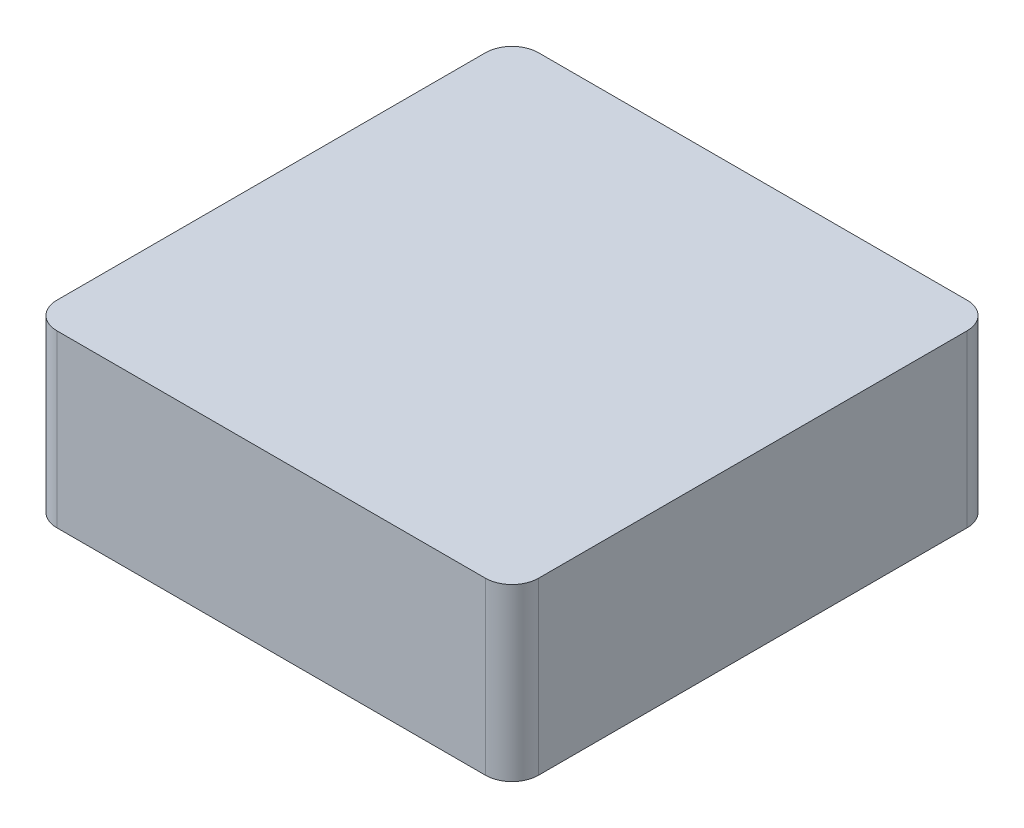
ISO-10303-21;
HEADER;
FILE_DESCRIPTION(('STEP AP214'),'2;1');
FILE_NAME('part.step','',(''),(''),'','','');
FILE_SCHEMA(('AUTOMOTIVE_DESIGN { 1 0 10303 214 1 1 1 1 }'));
ENDSEC;
DATA;
#1=APPLICATION_CONTEXT('core data for automotive mechanical design processes');
#2=APPLICATION_PROTOCOL_DEFINITION('international standard','automotive_design',2000,#1);
#3=PRODUCT_CONTEXT('',#1,'mechanical');
#4=PRODUCT('Part','Part','',(#3));
#5=PRODUCT_RELATED_PRODUCT_CATEGORY('part','',(#4));
#6=PRODUCT_DEFINITION_FORMATION('','',#4);
#7=PRODUCT_DEFINITION_CONTEXT('part definition',#1,'design');
#8=PRODUCT_DEFINITION('design','',#6,#7);
#9=PRODUCT_DEFINITION_SHAPE('','',#8);
#10=(LENGTH_UNIT() NAMED_UNIT(*) SI_UNIT(.MILLI.,.METRE.));
#11=(NAMED_UNIT(*) PLANE_ANGLE_UNIT() SI_UNIT($,.RADIAN.));
#12=(NAMED_UNIT(*) SI_UNIT($,.STERADIAN.) SOLID_ANGLE_UNIT());
#13=UNCERTAINTY_MEASURE_WITH_UNIT(LENGTH_MEASURE(1.E-05),#10,'distance_accuracy_value','');
#14=(GEOMETRIC_REPRESENTATION_CONTEXT(3) GLOBAL_UNCERTAINTY_ASSIGNED_CONTEXT((#13)) GLOBAL_UNIT_ASSIGNED_CONTEXT((#10,
#11,#12)) REPRESENTATION_CONTEXT('',''));
#15=CARTESIAN_POINT('',(0.,0.,0.));
#16=DIRECTION('',(0.,0.,1.));
#17=DIRECTION('',(1.,0.,0.));
#18=AXIS2_PLACEMENT_3D('',#15,#16,#17);
#19=CARTESIAN_POINT('',(0.,45.,0.));
#20=DIRECTION('',(1.,0.,0.));
#21=DIRECTION('',(0.,0.,-1.));
#22=AXIS2_PLACEMENT_3D('',#19,#20,#21);
#23=PLANE('',#22);
#24=DIRECTION('',(0.,0.,1.));
#25=VECTOR('',#24,1.);
#26=CARTESIAN_POINT('',(0.,45.,0.));
#27=LINE('',#26,#25);
#28=CARTESIAN_POINT('',(0.,45.,-120.));
#29=VERTEX_POINT('',#28);
#30=CARTESIAN_POINT('',(0.,45.,-7.));
#31=VERTEX_POINT('',#30);
#32=EDGE_CURVE('E126',#29,#31,#27,.T.);
#33=ORIENTED_EDGE('',*,*,#32,.F.);
#34=DIRECTION('',(0.,-1.,0.));
#35=VECTOR('',#34,1.);
#36=CARTESIAN_POINT('',(0.,45.,-120.));
#37=LINE('',#36,#35);
#38=CARTESIAN_POINT('',(0.,0.,-120.));
#39=VERTEX_POINT('',#38);
#40=EDGE_CURVE('E152',#29,#39,#37,.T.);
#41=ORIENTED_EDGE('',*,*,#40,.T.);
#42=DIRECTION('',(0.,0.,1.));
#43=VECTOR('',#42,1.);
#44=CARTESIAN_POINT('',(0.,0.,0.));
#45=LINE('',#44,#43);
#46=CARTESIAN_POINT('',(0.,0.,-7.));
#47=VERTEX_POINT('',#46);
#48=EDGE_CURVE('E160',#39,#47,#45,.T.);
#49=ORIENTED_EDGE('',*,*,#48,.T.);
#50=DIRECTION('',(0.,-1.,0.));
#51=VECTOR('',#50,1.);
#52=CARTESIAN_POINT('',(0.,45.,-7.));
#53=LINE('',#52,#51);
#54=EDGE_CURVE('E150',#47,#31,#53,.F.);
#55=ORIENTED_EDGE('',*,*,#54,.T.);
#56=EDGE_LOOP('',(#33,#41,#49,#55));
#57=FACE_BOUND('',#56,.T.);
#58=ADVANCED_FACE('F35',(#57),#23,.F.);
#59=CARTESIAN_POINT('',(0.,45.,0.));
#60=DIRECTION('',(0.,0.,-1.));
#61=DIRECTION('',(-1.,0.,0.));
#62=AXIS2_PLACEMENT_3D('',#59,#60,#61);
#63=PLANE('',#62);
#64=DIRECTION('',(1.,0.,0.));
#65=VECTOR('',#64,1.);
#66=CARTESIAN_POINT('',(0.,0.,0.));
#67=LINE('',#66,#65);
#68=CARTESIAN_POINT('',(7.,0.,0.));
#69=VERTEX_POINT('',#68);
#70=CARTESIAN_POINT('',(120.,0.,0.));
#71=VERTEX_POINT('',#70);
#72=EDGE_CURVE('E131',#69,#71,#67,.T.);
#73=ORIENTED_EDGE('',*,*,#72,.T.);
#74=DIRECTION('',(0.,-1.,0.));
#75=VECTOR('',#74,1.);
#76=CARTESIAN_POINT('',(120.,45.,0.));
#77=LINE('',#76,#75);
#78=CARTESIAN_POINT('',(120.,45.,0.));
#79=VERTEX_POINT('',#78);
#80=EDGE_CURVE('E11',#71,#79,#77,.F.);
#81=ORIENTED_EDGE('',*,*,#80,.T.);
#82=DIRECTION('',(1.,0.,0.));
#83=VECTOR('',#82,1.);
#84=CARTESIAN_POINT('',(0.,45.,0.));
#85=LINE('',#84,#83);
#86=CARTESIAN_POINT('',(7.,45.,0.));
#87=VERTEX_POINT('',#86);
#88=EDGE_CURVE('E129',#87,#79,#85,.T.);
#89=ORIENTED_EDGE('',*,*,#88,.F.);
#90=DIRECTION('',(0.,-1.,0.));
#91=VECTOR('',#90,1.);
#92=CARTESIAN_POINT('',(7.,45.,0.));
#93=LINE('',#92,#91);
#94=EDGE_CURVE('E43',#87,#69,#93,.T.);
#95=ORIENTED_EDGE('',*,*,#94,.T.);
#96=EDGE_LOOP('',(#73,#81,#89,#95));
#97=FACE_BOUND('',#96,.T.);
#98=ADVANCED_FACE('F157',(#97),#63,.F.);
#99=CARTESIAN_POINT('',(127.,45.,0.));
#100=DIRECTION('',(-1.,0.,0.));
#101=DIRECTION('',(0.,0.,1.));
#102=AXIS2_PLACEMENT_3D('',#99,#100,#101);
#103=PLANE('',#102);
#104=DIRECTION('',(0.,0.,-1.));
#105=VECTOR('',#104,1.);
#106=CARTESIAN_POINT('',(127.,0.,0.));
#107=LINE('',#106,#105);
#108=CARTESIAN_POINT('',(127.,0.,-7.));
#109=VERTEX_POINT('',#108);
#110=CARTESIAN_POINT('',(127.,0.,-120.));
#111=VERTEX_POINT('',#110);
#112=EDGE_CURVE('E127',#109,#111,#107,.T.);
#113=ORIENTED_EDGE('',*,*,#112,.T.);
#114=DIRECTION('',(0.,-1.,0.));
#115=VECTOR('',#114,1.);
#116=CARTESIAN_POINT('',(127.,45.,-120.));
#117=LINE('',#116,#115);
#118=CARTESIAN_POINT('',(127.,45.,-120.));
#119=VERTEX_POINT('',#118);
#120=EDGE_CURVE('E105',#111,#119,#117,.F.);
#121=ORIENTED_EDGE('',*,*,#120,.T.);
#122=DIRECTION('',(0.,0.,-1.));
#123=VECTOR('',#122,1.);
#124=CARTESIAN_POINT('',(127.,45.,0.));
#125=LINE('',#124,#123);
#126=CARTESIAN_POINT('',(127.,45.,-7.));
#127=VERTEX_POINT('',#126);
#128=EDGE_CURVE('E164',#127,#119,#125,.T.);
#129=ORIENTED_EDGE('',*,*,#128,.F.);
#130=DIRECTION('',(0.,-1.,0.));
#131=VECTOR('',#130,1.);
#132=CARTESIAN_POINT('',(127.,45.,-7.));
#133=LINE('',#132,#131);
#134=EDGE_CURVE('E110',#127,#109,#133,.T.);
#135=ORIENTED_EDGE('',*,*,#134,.T.);
#136=EDGE_LOOP('',(#113,#121,#129,#135));
#137=FACE_BOUND('',#136,.T.);
#138=ADVANCED_FACE('F174',(#137),#103,.F.);
#139=CARTESIAN_POINT('',(0.,45.,-127.));
#140=DIRECTION('',(0.,0.,1.));
#141=DIRECTION('',(1.,0.,0.));
#142=AXIS2_PLACEMENT_3D('',#139,#140,#141);
#143=PLANE('',#142);
#144=DIRECTION('',(-1.,0.,0.));
#145=VECTOR('',#144,1.);
#146=CARTESIAN_POINT('',(0.,45.,-127.));
#147=LINE('',#146,#145);
#148=CARTESIAN_POINT('',(120.,45.,-127.));
#149=VERTEX_POINT('',#148);
#150=CARTESIAN_POINT('',(7.,45.,-127.));
#151=VERTEX_POINT('',#150);
#152=EDGE_CURVE('E120',#149,#151,#147,.T.);
#153=ORIENTED_EDGE('',*,*,#152,.F.);
#154=DIRECTION('',(0.,-1.,0.));
#155=VECTOR('',#154,1.);
#156=CARTESIAN_POINT('',(120.,45.,-127.));
#157=LINE('',#156,#155);
#158=CARTESIAN_POINT('',(120.,0.,-127.));
#159=VERTEX_POINT('',#158);
#160=EDGE_CURVE('E104',#149,#159,#157,.T.);
#161=ORIENTED_EDGE('',*,*,#160,.T.);
#162=DIRECTION('',(-1.,0.,0.));
#163=VECTOR('',#162,1.);
#164=CARTESIAN_POINT('',(0.,0.,-127.));
#165=LINE('',#164,#163);
#166=CARTESIAN_POINT('',(7.,0.,-127.));
#167=VERTEX_POINT('',#166);
#168=EDGE_CURVE('E117',#159,#167,#165,.T.);
#169=ORIENTED_EDGE('',*,*,#168,.T.);
#170=DIRECTION('',(0.,-1.,0.));
#171=VECTOR('',#170,1.);
#172=CARTESIAN_POINT('',(7.,45.,-127.));
#173=LINE('',#172,#171);
#174=EDGE_CURVE('E122',#167,#151,#173,.F.);
#175=ORIENTED_EDGE('',*,*,#174,.T.);
#176=EDGE_LOOP('',(#153,#161,#169,#175));
#177=FACE_BOUND('',#176,.T.);
#178=ADVANCED_FACE('F116',(#177),#143,.F.);
#179=CARTESIAN_POINT('',(0.,45.,0.));
#180=DIRECTION('',(0.,-1.,0.));
#181=DIRECTION('',(0.,0.,-1.));
#182=AXIS2_PLACEMENT_3D('',#179,#180,#181);
#183=PLANE('',#182);
#184=ORIENTED_EDGE('',*,*,#128,.T.);
#185=CARTESIAN_POINT('',(120.,45.,-120.));
#186=DIRECTION('',(0.,-1.,0.));
#187=DIRECTION('',(0.,0.,-1.));
#188=AXIS2_PLACEMENT_3D('',#185,#186,#187);
#189=CIRCLE('',#188,7.);
#190=EDGE_CURVE('E148',#119,#149,#189,.F.);
#191=ORIENTED_EDGE('',*,*,#190,.T.);
#192=ORIENTED_EDGE('',*,*,#152,.T.);
#193=CARTESIAN_POINT('',(7.,45.,-120.));
#194=DIRECTION('',(0.,-1.,0.));
#195=DIRECTION('',(0.,0.,-1.));
#196=AXIS2_PLACEMENT_3D('',#193,#194,#195);
#197=CIRCLE('',#196,7.);
#198=EDGE_CURVE('E146',#151,#29,#197,.F.);
#199=ORIENTED_EDGE('',*,*,#198,.T.);
#200=ORIENTED_EDGE('',*,*,#32,.T.);
#201=CARTESIAN_POINT('',(7.,45.,-7.));
#202=DIRECTION('',(0.,-1.,0.));
#203=DIRECTION('',(0.,0.,-1.));
#204=AXIS2_PLACEMENT_3D('',#201,#202,#203);
#205=CIRCLE('',#204,7.);
#206=EDGE_CURVE('E55',#31,#87,#205,.F.);
#207=ORIENTED_EDGE('',*,*,#206,.T.);
#208=ORIENTED_EDGE('',*,*,#88,.T.);
#209=CARTESIAN_POINT('',(120.,45.,-7.));
#210=DIRECTION('',(0.,-1.,0.));
#211=DIRECTION('',(0.,0.,-1.));
#212=AXIS2_PLACEMENT_3D('',#209,#210,#211);
#213=CIRCLE('',#212,7.);
#214=EDGE_CURVE('E144',#79,#127,#213,.F.);
#215=ORIENTED_EDGE('',*,*,#214,.T.);
#216=EDGE_LOOP('',(#184,#191,#192,#199,#200,#207,#208,#215));
#217=FACE_BOUND('',#216,.T.);
#218=ADVANCED_FACE('F168',(#217),#183,.F.);
#219=CARTESIAN_POINT('',(0.,0.,0.));
#220=DIRECTION('',(0.,-1.,0.));
#221=DIRECTION('',(0.,0.,-1.));
#222=AXIS2_PLACEMENT_3D('',#219,#220,#221);
#223=PLANE('',#222);
#224=ORIENTED_EDGE('',*,*,#168,.F.);
#225=CARTESIAN_POINT('',(120.,0.,-120.));
#226=DIRECTION('',(0.,-1.,0.));
#227=DIRECTION('',(0.,0.,-1.));
#228=AXIS2_PLACEMENT_3D('',#225,#226,#227);
#229=CIRCLE('',#228,7.);
#230=EDGE_CURVE('E100',#159,#111,#229,.T.);
#231=ORIENTED_EDGE('',*,*,#230,.T.);
#232=ORIENTED_EDGE('',*,*,#112,.F.);
#233=CARTESIAN_POINT('',(120.,0.,-7.));
#234=DIRECTION('',(0.,-1.,0.));
#235=DIRECTION('',(0.,0.,-1.));
#236=AXIS2_PLACEMENT_3D('',#233,#234,#235);
#237=CIRCLE('',#236,7.);
#238=EDGE_CURVE('E137',#109,#71,#237,.T.);
#239=ORIENTED_EDGE('',*,*,#238,.T.);
#240=ORIENTED_EDGE('',*,*,#72,.F.);
#241=CARTESIAN_POINT('',(7.,0.,-7.));
#242=DIRECTION('',(0.,-1.,0.));
#243=DIRECTION('',(0.,0.,-1.));
#244=AXIS2_PLACEMENT_3D('',#241,#242,#243);
#245=CIRCLE('',#244,7.);
#246=EDGE_CURVE('E121',#69,#47,#245,.T.);
#247=ORIENTED_EDGE('',*,*,#246,.T.);
#248=ORIENTED_EDGE('',*,*,#48,.F.);
#249=CARTESIAN_POINT('',(7.,0.,-120.));
#250=DIRECTION('',(0.,-1.,0.));
#251=DIRECTION('',(0.,0.,-1.));
#252=AXIS2_PLACEMENT_3D('',#249,#250,#251);
#253=CIRCLE('',#252,7.);
#254=EDGE_CURVE('E111',#39,#167,#253,.T.);
#255=ORIENTED_EDGE('',*,*,#254,.T.);
#256=EDGE_LOOP('',(#224,#231,#232,#239,#240,#247,#248,#255));
#257=FACE_BOUND('',#256,.T.);
#258=ADVANCED_FACE('F124',(#257),#223,.T.);
#259=CARTESIAN_POINT('',(120.,45.,-120.));
#260=DIRECTION('',(0.,-1.,0.));
#261=DIRECTION('',(0.,0.,-1.));
#262=AXIS2_PLACEMENT_3D('',#259,#260,#261);
#263=CYLINDRICAL_SURFACE('',#262,7.);
#264=ORIENTED_EDGE('',*,*,#190,.F.);
#265=ORIENTED_EDGE('',*,*,#120,.F.);
#266=ORIENTED_EDGE('',*,*,#230,.F.);
#267=ORIENTED_EDGE('',*,*,#160,.F.);
#268=EDGE_LOOP('',(#264,#265,#266,#267));
#269=FACE_BOUND('',#268,.T.);
#270=ADVANCED_FACE('F103',(#269),#263,.T.);
#271=CARTESIAN_POINT('',(7.,45.,-120.));
#272=DIRECTION('',(0.,-1.,0.));
#273=DIRECTION('',(0.,0.,-1.));
#274=AXIS2_PLACEMENT_3D('',#271,#272,#273);
#275=CYLINDRICAL_SURFACE('',#274,7.);
#276=ORIENTED_EDGE('',*,*,#198,.F.);
#277=ORIENTED_EDGE('',*,*,#174,.F.);
#278=ORIENTED_EDGE('',*,*,#254,.F.);
#279=ORIENTED_EDGE('',*,*,#40,.F.);
#280=EDGE_LOOP('',(#276,#277,#278,#279));
#281=FACE_BOUND('',#280,.T.);
#282=ADVANCED_FACE('F179',(#281),#275,.T.);
#283=CARTESIAN_POINT('',(120.,45.,-7.));
#284=DIRECTION('',(0.,-1.,0.));
#285=DIRECTION('',(0.,0.,-1.));
#286=AXIS2_PLACEMENT_3D('',#283,#284,#285);
#287=CYLINDRICAL_SURFACE('',#286,7.);
#288=ORIENTED_EDGE('',*,*,#214,.F.);
#289=ORIENTED_EDGE('',*,*,#80,.F.);
#290=ORIENTED_EDGE('',*,*,#238,.F.);
#291=ORIENTED_EDGE('',*,*,#134,.F.);
#292=EDGE_LOOP('',(#288,#289,#290,#291));
#293=FACE_BOUND('',#292,.T.);
#294=ADVANCED_FACE('F172',(#293),#287,.T.);
#295=CARTESIAN_POINT('',(7.,45.,-7.));
#296=DIRECTION('',(0.,-1.,0.));
#297=DIRECTION('',(0.,0.,-1.));
#298=AXIS2_PLACEMENT_3D('',#295,#296,#297);
#299=CYLINDRICAL_SURFACE('',#298,7.);
#300=ORIENTED_EDGE('',*,*,#206,.F.);
#301=ORIENTED_EDGE('',*,*,#54,.F.);
#302=ORIENTED_EDGE('',*,*,#246,.F.);
#303=ORIENTED_EDGE('',*,*,#94,.F.);
#304=EDGE_LOOP('',(#300,#301,#302,#303));
#305=FACE_BOUND('',#304,.T.);
#306=ADVANCED_FACE('F37',(#305),#299,.T.);
#307=CLOSED_SHELL('',(#58,#98,#138,#178,#218,#258,#270,#282,#294,#306));
#308=MANIFOLD_SOLID_BREP('B2',#307);
#309=ADVANCED_BREP_SHAPE_REPRESENTATION('',(#18,#308),#14);
#310=SHAPE_DEFINITION_REPRESENTATION(#9,#309);
ENDSEC;
END-ISO-10303-21;
